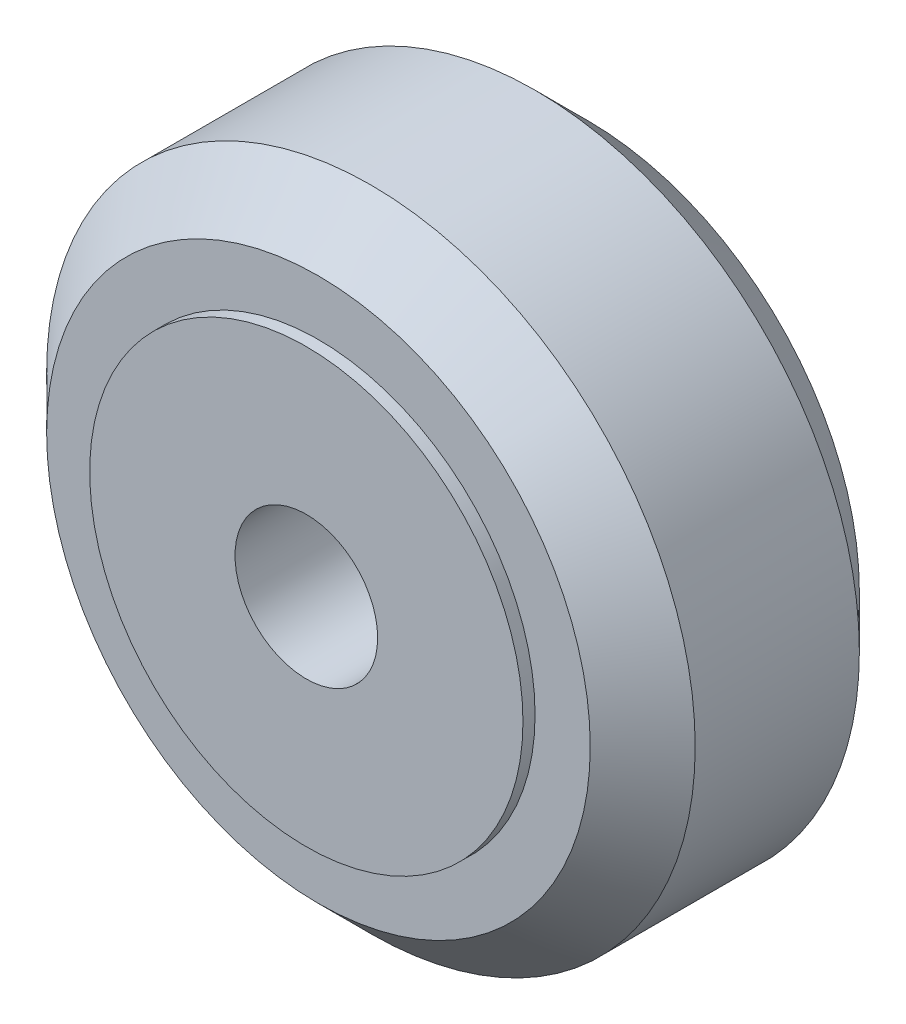
ISO-10303-21;
HEADER;
FILE_DESCRIPTION(('STEP AP214'),'2;1');
FILE_NAME('part.step','',(''),(''),'','','');
FILE_SCHEMA(('AUTOMOTIVE_DESIGN { 1 0 10303 214 1 1 1 1 }'));
ENDSEC;
DATA;
#1=APPLICATION_CONTEXT('core data for automotive mechanical design processes');
#2=APPLICATION_PROTOCOL_DEFINITION('international standard','automotive_design',2000,#1);
#3=PRODUCT_CONTEXT('',#1,'mechanical');
#4=PRODUCT('Part','Part','',(#3));
#5=PRODUCT_RELATED_PRODUCT_CATEGORY('part','',(#4));
#6=PRODUCT_DEFINITION_FORMATION('','',#4);
#7=PRODUCT_DEFINITION_CONTEXT('part definition',#1,'design');
#8=PRODUCT_DEFINITION('design','',#6,#7);
#9=PRODUCT_DEFINITION_SHAPE('','',#8);
#10=(LENGTH_UNIT() NAMED_UNIT(*) SI_UNIT(.MILLI.,.METRE.));
#11=(NAMED_UNIT(*) PLANE_ANGLE_UNIT() SI_UNIT($,.RADIAN.));
#12=(NAMED_UNIT(*) SI_UNIT($,.STERADIAN.) SOLID_ANGLE_UNIT());
#13=UNCERTAINTY_MEASURE_WITH_UNIT(LENGTH_MEASURE(1.E-05),#10,'distance_accuracy_value','');
#14=(GEOMETRIC_REPRESENTATION_CONTEXT(3) GLOBAL_UNCERTAINTY_ASSIGNED_CONTEXT((#13)) GLOBAL_UNIT_ASSIGNED_CONTEXT((#10,
#11,#12)) REPRESENTATION_CONTEXT('',''));
#15=CARTESIAN_POINT('',(0.,0.,0.));
#16=DIRECTION('',(0.,0.,1.));
#17=DIRECTION('',(1.,0.,0.));
#18=AXIS2_PLACEMENT_3D('',#15,#16,#17);
#19=CARTESIAN_POINT('',(0.,2.65,5.45));
#20=DIRECTION('',(0.,0.,-1.));
#21=DIRECTION('',(-1.,0.,0.));
#22=AXIS2_PLACEMENT_3D('',#19,#20,#21);
#23=PLANE('',#22);
#24=CARTESIAN_POINT('',(0.,0.,5.45));
#25=DIRECTION('',(0.,0.,1.));
#26=DIRECTION('',(1.,0.,0.));
#27=AXIS2_PLACEMENT_3D('',#24,#25,#26);
#28=CIRCLE('',#27,2.65);
#29=CARTESIAN_POINT('',(2.65,0.,5.45));
#30=VERTEX_POINT('',#29);
#31=EDGE_CURVE('E65',#30,#30,#28,.T.);
#32=ORIENTED_EDGE('',*,*,#31,.F.);
#33=EDGE_LOOP('',(#32));
#34=FACE_BOUND('',#33,.T.);
#35=CARTESIAN_POINT('',(0.,0.,5.45));
#36=DIRECTION('',(0.,0.,1.));
#37=DIRECTION('',(1.,0.,0.));
#38=AXIS2_PLACEMENT_3D('',#35,#36,#37);
#39=CIRCLE('',#38,8.05);
#40=CARTESIAN_POINT('',(8.05,0.,5.45));
#41=VERTEX_POINT('',#40);
#42=EDGE_CURVE('E10',#41,#41,#39,.T.);
#43=ORIENTED_EDGE('',*,*,#42,.T.);
#44=EDGE_LOOP('',(#43));
#45=FACE_BOUND('',#44,.T.);
#46=ADVANCED_FACE('F31',(#34,#45),#23,.F.);
#47=CARTESIAN_POINT('',(0.,0.,10.4458333333333));
#48=DIRECTION('',(0.,0.,1.));
#49=DIRECTION('',(1.,0.,0.));
#50=AXIS2_PLACEMENT_3D('',#47,#48,#49);
#51=CYLINDRICAL_SURFACE('',#50,8.05);
#52=ORIENTED_EDGE('',*,*,#42,.F.);
#53=EDGE_LOOP('',(#52));
#54=FACE_BOUND('',#53,.T.);
#55=CARTESIAN_POINT('',(0.,0.,5.));
#56=DIRECTION('',(0.,0.,1.));
#57=DIRECTION('',(1.,0.,0.));
#58=AXIS2_PLACEMENT_3D('',#55,#56,#57);
#59=CIRCLE('',#58,8.05);
#60=CARTESIAN_POINT('',(8.05,0.,5.));
#61=VERTEX_POINT('',#60);
#62=EDGE_CURVE('E37',#61,#61,#59,.T.);
#63=ORIENTED_EDGE('',*,*,#62,.T.);
#64=EDGE_LOOP('',(#63));
#65=FACE_BOUND('',#64,.T.);
#66=ADVANCED_FACE('F72',(#54,#65),#51,.T.);
#67=CARTESIAN_POINT('',(0.,8.05,5.));
#68=DIRECTION('',(0.,0.,-1.));
#69=DIRECTION('',(-1.,0.,0.));
#70=AXIS2_PLACEMENT_3D('',#67,#68,#69);
#71=PLANE('',#70);
#72=ORIENTED_EDGE('',*,*,#62,.F.);
#73=EDGE_LOOP('',(#72));
#74=FACE_BOUND('',#73,.T.);
#75=CARTESIAN_POINT('',(0.,0.,5.));
#76=DIRECTION('',(0.,0.,1.));
#77=DIRECTION('',(1.,0.,0.));
#78=AXIS2_PLACEMENT_3D('',#75,#76,#77);
#79=CIRCLE('',#78,10.1);
#80=CARTESIAN_POINT('',(10.1,0.,5.));
#81=VERTEX_POINT('',#80);
#82=EDGE_CURVE('E41',#81,#81,#79,.T.);
#83=ORIENTED_EDGE('',*,*,#82,.T.);
#84=EDGE_LOOP('',(#83));
#85=FACE_BOUND('',#84,.T.);
#86=ADVANCED_FACE('F76',(#74,#85),#71,.F.);
#87=CARTESIAN_POINT('',(0.,0.,3.05));
#88=DIRECTION('',(0.,0.,-1.));
#89=DIRECTION('',(-1.,0.,0.));
#90=AXIS2_PLACEMENT_3D('',#87,#88,#89);
#91=CONICAL_SURFACE('',#90,12.05,0.785398163397448);
#92=ORIENTED_EDGE('',*,*,#82,.F.);
#93=EDGE_LOOP('',(#92));
#94=FACE_BOUND('',#93,.T.);
#95=CARTESIAN_POINT('',(0.,0.,3.05));
#96=DIRECTION('',(0.,0.,1.));
#97=DIRECTION('',(1.,0.,0.));
#98=AXIS2_PLACEMENT_3D('',#95,#96,#97);
#99=CIRCLE('',#98,12.05);
#100=CARTESIAN_POINT('',(12.05,0.,3.05));
#101=VERTEX_POINT('',#100);
#102=EDGE_CURVE('E45',#101,#101,#99,.T.);
#103=ORIENTED_EDGE('',*,*,#102,.T.);
#104=EDGE_LOOP('',(#103));
#105=FACE_BOUND('',#104,.T.);
#106=ADVANCED_FACE('F81',(#94,#105),#91,.T.);
#107=CARTESIAN_POINT('',(0.,0.,10.4458333333333));
#108=DIRECTION('',(0.,0.,1.));
#109=DIRECTION('',(1.,0.,0.));
#110=AXIS2_PLACEMENT_3D('',#107,#108,#109);
#111=CYLINDRICAL_SURFACE('',#110,12.05);
#112=ORIENTED_EDGE('',*,*,#102,.F.);
#113=EDGE_LOOP('',(#112));
#114=FACE_BOUND('',#113,.T.);
#115=CARTESIAN_POINT('',(0.,0.,-3.05));
#116=DIRECTION('',(0.,0.,1.));
#117=DIRECTION('',(1.,0.,0.));
#118=AXIS2_PLACEMENT_3D('',#115,#116,#117);
#119=CIRCLE('',#118,12.05);
#120=CARTESIAN_POINT('',(12.05,0.,-3.05));
#121=VERTEX_POINT('',#120);
#122=EDGE_CURVE('E50',#121,#121,#119,.T.);
#123=ORIENTED_EDGE('',*,*,#122,.T.);
#124=EDGE_LOOP('',(#123));
#125=FACE_BOUND('',#124,.T.);
#126=ADVANCED_FACE('F87',(#114,#125),#111,.T.);
#127=CARTESIAN_POINT('',(0.,0.,-5.));
#128=DIRECTION('',(0.,0.,1.));
#129=DIRECTION('',(1.,0.,0.));
#130=AXIS2_PLACEMENT_3D('',#127,#128,#129);
#131=CONICAL_SURFACE('',#130,10.1,0.785398163397448);
#132=ORIENTED_EDGE('',*,*,#122,.F.);
#133=EDGE_LOOP('',(#132));
#134=FACE_BOUND('',#133,.T.);
#135=CARTESIAN_POINT('',(0.,0.,-5.));
#136=DIRECTION('',(0.,0.,1.));
#137=DIRECTION('',(1.,0.,0.));
#138=AXIS2_PLACEMENT_3D('',#135,#136,#137);
#139=CIRCLE('',#138,10.1);
#140=CARTESIAN_POINT('',(10.1,0.,-5.));
#141=VERTEX_POINT('',#140);
#142=EDGE_CURVE('E53',#141,#141,#139,.T.);
#143=ORIENTED_EDGE('',*,*,#142,.T.);
#144=EDGE_LOOP('',(#143));
#145=FACE_BOUND('',#144,.T.);
#146=ADVANCED_FACE('F91',(#134,#145),#131,.T.);
#147=CARTESIAN_POINT('',(0.,8.05,-5.));
#148=DIRECTION('',(0.,0.,1.));
#149=DIRECTION('',(1.,0.,0.));
#150=AXIS2_PLACEMENT_3D('',#147,#148,#149);
#151=PLANE('',#150);
#152=ORIENTED_EDGE('',*,*,#142,.F.);
#153=EDGE_LOOP('',(#152));
#154=FACE_BOUND('',#153,.T.);
#155=CARTESIAN_POINT('',(0.,0.,-5.));
#156=DIRECTION('',(0.,0.,1.));
#157=DIRECTION('',(1.,0.,0.));
#158=AXIS2_PLACEMENT_3D('',#155,#156,#157);
#159=CIRCLE('',#158,8.05);
#160=CARTESIAN_POINT('',(8.05,0.,-5.));
#161=VERTEX_POINT('',#160);
#162=EDGE_CURVE('E56',#161,#161,#159,.T.);
#163=ORIENTED_EDGE('',*,*,#162,.T.);
#164=EDGE_LOOP('',(#163));
#165=FACE_BOUND('',#164,.T.);
#166=ADVANCED_FACE('F95',(#154,#165),#151,.F.);
#167=CARTESIAN_POINT('',(0.,0.,10.4458333333333));
#168=DIRECTION('',(0.,0.,1.));
#169=DIRECTION('',(1.,0.,0.));
#170=AXIS2_PLACEMENT_3D('',#167,#168,#169);
#171=CYLINDRICAL_SURFACE('',#170,8.05);
#172=ORIENTED_EDGE('',*,*,#162,.F.);
#173=EDGE_LOOP('',(#172));
#174=FACE_BOUND('',#173,.T.);
#175=CARTESIAN_POINT('',(0.,0.,-5.45));
#176=DIRECTION('',(0.,0.,1.));
#177=DIRECTION('',(1.,0.,0.));
#178=AXIS2_PLACEMENT_3D('',#175,#176,#177);
#179=CIRCLE('',#178,8.05);
#180=CARTESIAN_POINT('',(8.05,0.,-5.45));
#181=VERTEX_POINT('',#180);
#182=EDGE_CURVE('E59',#181,#181,#179,.T.);
#183=ORIENTED_EDGE('',*,*,#182,.T.);
#184=EDGE_LOOP('',(#183));
#185=FACE_BOUND('',#184,.T.);
#186=ADVANCED_FACE('F99',(#174,#185),#171,.T.);
#187=CARTESIAN_POINT('',(0.,2.65,-5.45));
#188=DIRECTION('',(0.,0.,1.));
#189=DIRECTION('',(1.,0.,0.));
#190=AXIS2_PLACEMENT_3D('',#187,#188,#189);
#191=PLANE('',#190);
#192=ORIENTED_EDGE('',*,*,#182,.F.);
#193=EDGE_LOOP('',(#192));
#194=FACE_BOUND('',#193,.T.);
#195=CARTESIAN_POINT('',(0.,0.,-5.45));
#196=DIRECTION('',(0.,0.,1.));
#197=DIRECTION('',(1.,0.,0.));
#198=AXIS2_PLACEMENT_3D('',#195,#196,#197);
#199=CIRCLE('',#198,2.65);
#200=CARTESIAN_POINT('',(2.65,0.,-5.45));
#201=VERTEX_POINT('',#200);
#202=EDGE_CURVE('E62',#201,#201,#199,.T.);
#203=ORIENTED_EDGE('',*,*,#202,.T.);
#204=EDGE_LOOP('',(#203));
#205=FACE_BOUND('',#204,.T.);
#206=ADVANCED_FACE('F103',(#194,#205),#191,.F.);
#207=CARTESIAN_POINT('',(0.,0.,10.4458333333333));
#208=DIRECTION('',(0.,0.,1.));
#209=DIRECTION('',(1.,0.,0.));
#210=AXIS2_PLACEMENT_3D('',#207,#208,#209);
#211=CYLINDRICAL_SURFACE('',#210,2.65);
#212=ORIENTED_EDGE('',*,*,#202,.F.);
#213=EDGE_LOOP('',(#212));
#214=FACE_BOUND('',#213,.T.);
#215=ORIENTED_EDGE('',*,*,#31,.T.);
#216=EDGE_LOOP('',(#215));
#217=FACE_BOUND('',#216,.T.);
#218=ADVANCED_FACE('F69',(#214,#217),#211,.F.);
#219=CLOSED_SHELL('',(#46,#66,#86,#106,#126,#146,#166,#186,#206,#218));
#220=MANIFOLD_SOLID_BREP('B2',#219);
#221=ADVANCED_BREP_SHAPE_REPRESENTATION('',(#18,#220),#14);
#222=SHAPE_DEFINITION_REPRESENTATION(#9,#221);
ENDSEC;
END-ISO-10303-21;
